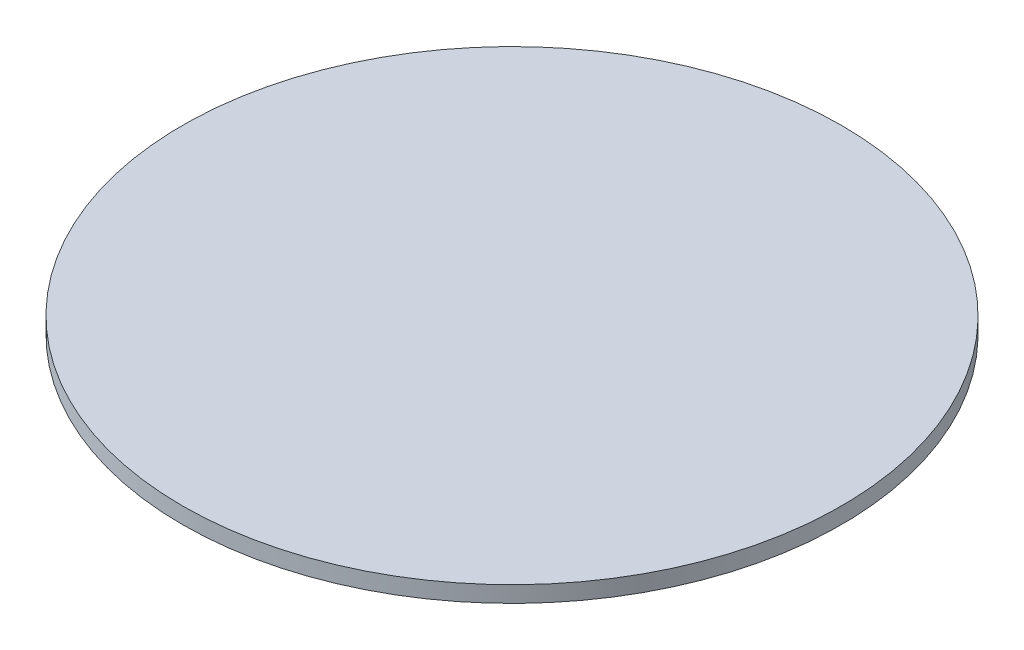
ISO-10303-21;
HEADER;
FILE_DESCRIPTION(('STEP AP214'),'2;1');
FILE_NAME('part.step','',(''),(''),'','','');
FILE_SCHEMA(('AUTOMOTIVE_DESIGN { 1 0 10303 214 1 1 1 1 }'));
ENDSEC;
DATA;
#1=APPLICATION_CONTEXT('core data for automotive mechanical design processes');
#2=APPLICATION_PROTOCOL_DEFINITION('international standard','automotive_design',2000,#1);
#3=PRODUCT_CONTEXT('',#1,'mechanical');
#4=PRODUCT('Part','Part','',(#3));
#5=PRODUCT_RELATED_PRODUCT_CATEGORY('part','',(#4));
#6=PRODUCT_DEFINITION_FORMATION('','',#4);
#7=PRODUCT_DEFINITION_CONTEXT('part definition',#1,'design');
#8=PRODUCT_DEFINITION('design','',#6,#7);
#9=PRODUCT_DEFINITION_SHAPE('','',#8);
#10=(LENGTH_UNIT() NAMED_UNIT(*) SI_UNIT(.MILLI.,.METRE.));
#11=(NAMED_UNIT(*) PLANE_ANGLE_UNIT() SI_UNIT($,.RADIAN.));
#12=(NAMED_UNIT(*) SI_UNIT($,.STERADIAN.) SOLID_ANGLE_UNIT());
#13=UNCERTAINTY_MEASURE_WITH_UNIT(LENGTH_MEASURE(1.E-05),#10,'distance_accuracy_value','');
#14=(GEOMETRIC_REPRESENTATION_CONTEXT(3) GLOBAL_UNCERTAINTY_ASSIGNED_CONTEXT((#13)) GLOBAL_UNIT_ASSIGNED_CONTEXT((#10,
#11,#12)) REPRESENTATION_CONTEXT('',''));
#15=CARTESIAN_POINT('',(0.,0.,0.));
#16=DIRECTION('',(0.,0.,1.));
#17=DIRECTION('',(1.,0.,0.));
#18=AXIS2_PLACEMENT_3D('',#15,#16,#17);
#19=CARTESIAN_POINT('',(0.,1.6,0.));
#20=DIRECTION('',(0.,-1.,0.));
#21=DIRECTION('',(0.,0.,-1.));
#22=AXIS2_PLACEMENT_3D('',#19,#20,#21);
#23=CYLINDRICAL_SURFACE('',#22,32.5);
#24=CARTESIAN_POINT('',(0.,1.6,0.));
#25=DIRECTION('',(0.,1.,0.));
#26=DIRECTION('',(0.,0.,1.));
#27=AXIS2_PLACEMENT_3D('',#24,#25,#26);
#28=CIRCLE('',#27,32.5);
#29=CARTESIAN_POINT('',(0.,1.6,32.5));
#30=VERTEX_POINT('',#29);
#31=EDGE_CURVE('E10',#30,#30,#28,.T.);
#32=ORIENTED_EDGE('',*,*,#31,.F.);
#33=EDGE_LOOP('',(#32));
#34=FACE_BOUND('',#33,.T.);
#35=CARTESIAN_POINT('',(0.,0.,0.));
#36=DIRECTION('',(0.,1.,0.));
#37=DIRECTION('',(0.,0.,1.));
#38=AXIS2_PLACEMENT_3D('',#35,#36,#37);
#39=CIRCLE('',#38,32.5);
#40=CARTESIAN_POINT('',(0.,0.,32.5));
#41=VERTEX_POINT('',#40);
#42=EDGE_CURVE('E42',#41,#41,#39,.T.);
#43=ORIENTED_EDGE('',*,*,#42,.T.);
#44=EDGE_LOOP('',(#43));
#45=FACE_BOUND('',#44,.T.);
#46=ADVANCED_FACE('F39',(#34,#45),#23,.T.);
#47=CARTESIAN_POINT('',(0.,1.6,0.));
#48=DIRECTION('',(0.,1.,0.));
#49=DIRECTION('',(0.,0.,1.));
#50=AXIS2_PLACEMENT_3D('',#47,#48,#49);
#51=PLANE('',#50);
#52=ORIENTED_EDGE('',*,*,#31,.T.);
#53=EDGE_LOOP('',(#52));
#54=FACE_BOUND('',#53,.T.);
#55=ADVANCED_FACE('F56',(#54),#51,.T.);
#56=CARTESIAN_POINT('',(0.,0.,0.));
#57=DIRECTION('',(0.,1.,0.));
#58=DIRECTION('',(0.,0.,1.));
#59=AXIS2_PLACEMENT_3D('',#56,#57,#58);
#60=PLANE('',#59);
#61=ORIENTED_EDGE('',*,*,#42,.F.);
#62=EDGE_LOOP('',(#61));
#63=FACE_BOUND('',#62,.T.);
#64=ADVANCED_FACE('F54',(#63),#60,.F.);
#65=CLOSED_SHELL('',(#46,#55,#64));
#66=MANIFOLD_SOLID_BREP('B2',#65);
#67=ADVANCED_BREP_SHAPE_REPRESENTATION('',(#18,#66),#14);
#68=SHAPE_DEFINITION_REPRESENTATION(#9,#67);
ENDSEC;
END-ISO-10303-21;
